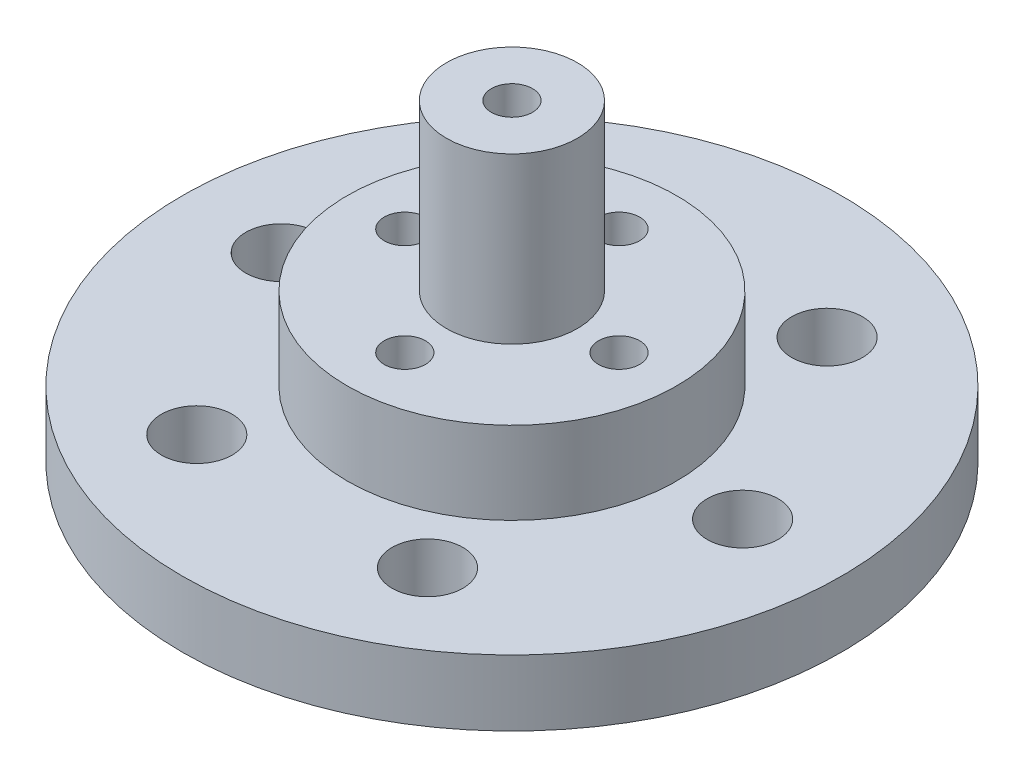
ISO-10303-21;
HEADER;
FILE_DESCRIPTION(('STEP AP214'),'2;1');
FILE_NAME('part.step','',(''),(''),'','','');
FILE_SCHEMA(('AUTOMOTIVE_DESIGN { 1 0 10303 214 1 1 1 1 }'));
ENDSEC;
DATA;
#1=APPLICATION_CONTEXT('core data for automotive mechanical design processes');
#2=APPLICATION_PROTOCOL_DEFINITION('international standard','automotive_design',2000,#1);
#3=PRODUCT_CONTEXT('',#1,'mechanical');
#4=PRODUCT('Part','Part','',(#3));
#5=PRODUCT_RELATED_PRODUCT_CATEGORY('part','',(#4));
#6=PRODUCT_DEFINITION_FORMATION('','',#4);
#7=PRODUCT_DEFINITION_CONTEXT('part definition',#1,'design');
#8=PRODUCT_DEFINITION('design','',#6,#7);
#9=PRODUCT_DEFINITION_SHAPE('','',#8);
#10=(LENGTH_UNIT() NAMED_UNIT(*) SI_UNIT(.MILLI.,.METRE.));
#11=(NAMED_UNIT(*) PLANE_ANGLE_UNIT() SI_UNIT($,.RADIAN.));
#12=(NAMED_UNIT(*) SI_UNIT($,.STERADIAN.) SOLID_ANGLE_UNIT());
#13=UNCERTAINTY_MEASURE_WITH_UNIT(LENGTH_MEASURE(1.E-05),#10,'distance_accuracy_value','');
#14=(GEOMETRIC_REPRESENTATION_CONTEXT(3) GLOBAL_UNCERTAINTY_ASSIGNED_CONTEXT((#13)) GLOBAL_UNIT_ASSIGNED_CONTEXT((#10,
#11,#12)) REPRESENTATION_CONTEXT('',''));
#15=CARTESIAN_POINT('',(0.,0.,0.));
#16=DIRECTION('',(0.,0.,1.));
#17=DIRECTION('',(1.,0.,0.));
#18=AXIS2_PLACEMENT_3D('',#15,#16,#17);
#19=CARTESIAN_POINT('',(0.,4.,0.));
#20=DIRECTION('',(0.,-1.,0.));
#21=DIRECTION('',(0.,0.,-1.));
#22=AXIS2_PLACEMENT_3D('',#19,#20,#21);
#23=CYLINDRICAL_SURFACE('',#22,20.);
#24=CARTESIAN_POINT('',(0.,4.,0.));
#25=DIRECTION('',(0.,1.,0.));
#26=DIRECTION('',(0.,0.,1.));
#27=AXIS2_PLACEMENT_3D('',#24,#25,#26);
#28=CIRCLE('',#27,20.);
#29=CARTESIAN_POINT('',(0.,4.,20.));
#30=VERTEX_POINT('',#29);
#31=EDGE_CURVE('E148',#30,#30,#28,.T.);
#32=ORIENTED_EDGE('',*,*,#31,.F.);
#33=EDGE_LOOP('',(#32));
#34=FACE_BOUND('',#33,.T.);
#35=CARTESIAN_POINT('',(0.,0.,0.));
#36=DIRECTION('',(0.,1.,0.));
#37=DIRECTION('',(0.,0.,1.));
#38=AXIS2_PLACEMENT_3D('',#35,#36,#37);
#39=CIRCLE('',#38,20.);
#40=CARTESIAN_POINT('',(0.,0.,20.));
#41=VERTEX_POINT('',#40);
#42=EDGE_CURVE('E44',#41,#41,#39,.T.);
#43=ORIENTED_EDGE('',*,*,#42,.T.);
#44=EDGE_LOOP('',(#43));
#45=FACE_BOUND('',#44,.T.);
#46=ADVANCED_FACE('F41',(#34,#45),#23,.T.);
#47=CARTESIAN_POINT('',(0.,4.,0.));
#48=DIRECTION('',(0.,1.,0.));
#49=DIRECTION('',(0.,0.,1.));
#50=AXIS2_PLACEMENT_3D('',#47,#48,#49);
#51=PLANE('',#50);
#52=CARTESIAN_POINT('',(-14.,4.,0.));
#53=DIRECTION('',(0.,1.,0.));
#54=DIRECTION('',(0.,0.,1.));
#55=AXIS2_PLACEMENT_3D('',#52,#53,#54);
#56=CIRCLE('',#55,2.15);
#57=CARTESIAN_POINT('',(-14.,4.,2.15));
#58=VERTEX_POINT('',#57);
#59=EDGE_CURVE('E105',#58,#58,#56,.T.);
#60=ORIENTED_EDGE('',*,*,#59,.F.);
#61=EDGE_LOOP('',(#60));
#62=FACE_BOUND('',#61,.T.);
#63=CARTESIAN_POINT('',(-6.99999999999997,4.,-12.1243556529822));
#64=DIRECTION('',(0.,1.,0.));
#65=DIRECTION('',(0.,0.,1.));
#66=AXIS2_PLACEMENT_3D('',#63,#64,#65);
#67=CIRCLE('',#66,2.15);
#68=CARTESIAN_POINT('',(-6.99999999999997,4.,-9.97435565298216));
#69=VERTEX_POINT('',#68);
#70=EDGE_CURVE('E111',#69,#69,#67,.T.);
#71=ORIENTED_EDGE('',*,*,#70,.F.);
#72=EDGE_LOOP('',(#71));
#73=FACE_BOUND('',#72,.T.);
#74=CARTESIAN_POINT('',(7.00000000000006,4.,-12.1243556529821));
#75=DIRECTION('',(0.,1.,0.));
#76=DIRECTION('',(0.,0.,1.));
#77=AXIS2_PLACEMENT_3D('',#74,#75,#76);
#78=CIRCLE('',#77,2.15);
#79=CARTESIAN_POINT('',(7.00000000000006,4.,-9.97435565298211));
#80=VERTEX_POINT('',#79);
#81=EDGE_CURVE('E117',#80,#80,#78,.T.);
#82=ORIENTED_EDGE('',*,*,#81,.F.);
#83=EDGE_LOOP('',(#82));
#84=FACE_BOUND('',#83,.T.);
#85=CARTESIAN_POINT('',(14.,4.,0.));
#86=DIRECTION('',(0.,1.,0.));
#87=DIRECTION('',(0.,0.,1.));
#88=AXIS2_PLACEMENT_3D('',#85,#86,#87);
#89=CIRCLE('',#88,2.15);
#90=CARTESIAN_POINT('',(14.,4.,2.1500000000001));
#91=VERTEX_POINT('',#90);
#92=EDGE_CURVE('E123',#91,#91,#89,.T.);
#93=ORIENTED_EDGE('',*,*,#92,.F.);
#94=EDGE_LOOP('',(#93));
#95=FACE_BOUND('',#94,.T.);
#96=CARTESIAN_POINT('',(6.99999999999989,4.,12.1243556529822));
#97=DIRECTION('',(0.,1.,0.));
#98=DIRECTION('',(0.,0.,1.));
#99=AXIS2_PLACEMENT_3D('',#96,#97,#98);
#100=CIRCLE('',#99,2.15);
#101=CARTESIAN_POINT('',(6.99999999999989,4.,14.2743556529822));
#102=VERTEX_POINT('',#101);
#103=EDGE_CURVE('E129',#102,#102,#100,.T.);
#104=ORIENTED_EDGE('',*,*,#103,.F.);
#105=EDGE_LOOP('',(#104));
#106=FACE_BOUND('',#105,.T.);
#107=CARTESIAN_POINT('',(-7.00000000000014,4.,12.1243556529821));
#108=DIRECTION('',(0.,1.,0.));
#109=DIRECTION('',(0.,0.,1.));
#110=AXIS2_PLACEMENT_3D('',#107,#108,#109);
#111=CIRCLE('',#110,2.15);
#112=CARTESIAN_POINT('',(-7.00000000000014,4.,14.2743556529821));
#113=VERTEX_POINT('',#112);
#114=EDGE_CURVE('E135',#113,#113,#111,.T.);
#115=ORIENTED_EDGE('',*,*,#114,.F.);
#116=EDGE_LOOP('',(#115));
#117=FACE_BOUND('',#116,.T.);
#118=CARTESIAN_POINT('',(0.,4.,0.));
#119=DIRECTION('',(0.,1.,0.));
#120=DIRECTION('',(0.,0.,1.));
#121=AXIS2_PLACEMENT_3D('',#118,#119,#120);
#122=CIRCLE('',#121,10.);
#123=CARTESIAN_POINT('',(0.,4.,10.));
#124=VERTEX_POINT('',#123);
#125=EDGE_CURVE('E49',#124,#124,#122,.T.);
#126=ORIENTED_EDGE('',*,*,#125,.F.);
#127=EDGE_LOOP('',(#126));
#128=FACE_BOUND('',#127,.T.);
#129=ORIENTED_EDGE('',*,*,#31,.T.);
#130=EDGE_LOOP('',(#129));
#131=FACE_BOUND('',#130,.T.);
#132=ADVANCED_FACE('F159',(#62,#73,#84,#95,#106,#117,#128,#131),#51,.T.);
#133=CARTESIAN_POINT('',(0.,0.,0.));
#134=DIRECTION('',(0.,1.,0.));
#135=DIRECTION('',(0.,0.,1.));
#136=AXIS2_PLACEMENT_3D('',#133,#134,#135);
#137=PLANE('',#136);
#138=CARTESIAN_POINT('',(-14.,0.,0.));
#139=DIRECTION('',(0.,1.,0.));
#140=DIRECTION('',(0.,0.,1.));
#141=AXIS2_PLACEMENT_3D('',#138,#139,#140);
#142=CIRCLE('',#141,2.15);
#143=CARTESIAN_POINT('',(-14.,0.,2.15));
#144=VERTEX_POINT('',#143);
#145=EDGE_CURVE('E108',#144,#144,#142,.T.);
#146=ORIENTED_EDGE('',*,*,#145,.T.);
#147=EDGE_LOOP('',(#146));
#148=FACE_BOUND('',#147,.T.);
#149=CARTESIAN_POINT('',(-6.99999999999997,0.,-12.1243556529822));
#150=DIRECTION('',(0.,1.,0.));
#151=DIRECTION('',(0.,0.,1.));
#152=AXIS2_PLACEMENT_3D('',#149,#150,#151);
#153=CIRCLE('',#152,2.15);
#154=CARTESIAN_POINT('',(-6.99999999999997,0.,-9.97435565298216));
#155=VERTEX_POINT('',#154);
#156=EDGE_CURVE('E114',#155,#155,#153,.T.);
#157=ORIENTED_EDGE('',*,*,#156,.T.);
#158=EDGE_LOOP('',(#157));
#159=FACE_BOUND('',#158,.T.);
#160=CARTESIAN_POINT('',(7.00000000000006,0.,-12.1243556529821));
#161=DIRECTION('',(0.,1.,0.));
#162=DIRECTION('',(0.,0.,1.));
#163=AXIS2_PLACEMENT_3D('',#160,#161,#162);
#164=CIRCLE('',#163,2.15);
#165=CARTESIAN_POINT('',(7.00000000000006,0.,-9.97435565298211));
#166=VERTEX_POINT('',#165);
#167=EDGE_CURVE('E120',#166,#166,#164,.T.);
#168=ORIENTED_EDGE('',*,*,#167,.T.);
#169=EDGE_LOOP('',(#168));
#170=FACE_BOUND('',#169,.T.);
#171=CARTESIAN_POINT('',(14.,0.,0.));
#172=DIRECTION('',(0.,1.,0.));
#173=DIRECTION('',(0.,0.,1.));
#174=AXIS2_PLACEMENT_3D('',#171,#172,#173);
#175=CIRCLE('',#174,2.15);
#176=CARTESIAN_POINT('',(14.,0.,2.15000000000009));
#177=VERTEX_POINT('',#176);
#178=EDGE_CURVE('E126',#177,#177,#175,.T.);
#179=ORIENTED_EDGE('',*,*,#178,.T.);
#180=EDGE_LOOP('',(#179));
#181=FACE_BOUND('',#180,.T.);
#182=CARTESIAN_POINT('',(6.99999999999989,0.,12.1243556529822));
#183=DIRECTION('',(0.,1.,0.));
#184=DIRECTION('',(0.,0.,1.));
#185=AXIS2_PLACEMENT_3D('',#182,#183,#184);
#186=CIRCLE('',#185,2.15);
#187=CARTESIAN_POINT('',(6.99999999999989,0.,14.2743556529822));
#188=VERTEX_POINT('',#187);
#189=EDGE_CURVE('E132',#188,#188,#186,.T.);
#190=ORIENTED_EDGE('',*,*,#189,.T.);
#191=EDGE_LOOP('',(#190));
#192=FACE_BOUND('',#191,.T.);
#193=CARTESIAN_POINT('',(-7.00000000000014,0.,12.1243556529821));
#194=DIRECTION('',(0.,1.,0.));
#195=DIRECTION('',(0.,0.,1.));
#196=AXIS2_PLACEMENT_3D('',#193,#194,#195);
#197=CIRCLE('',#196,2.15);
#198=CARTESIAN_POINT('',(-7.00000000000014,0.,14.2743556529821));
#199=VERTEX_POINT('',#198);
#200=EDGE_CURVE('E138',#199,#199,#197,.T.);
#201=ORIENTED_EDGE('',*,*,#200,.T.);
#202=EDGE_LOOP('',(#201));
#203=FACE_BOUND('',#202,.T.);
#204=ORIENTED_EDGE('',*,*,#42,.F.);
#205=EDGE_LOOP('',(#204));
#206=FACE_BOUND('',#205,.T.);
#207=ADVANCED_FACE('F156',(#148,#159,#170,#181,#192,#203,#206),#137,.F.);
#208=CARTESIAN_POINT('',(0.,9.,0.));
#209=DIRECTION('',(0.,-1.,0.));
#210=DIRECTION('',(0.,0.,-1.));
#211=AXIS2_PLACEMENT_3D('',#208,#209,#210);
#212=CYLINDRICAL_SURFACE('',#211,10.);
#213=CARTESIAN_POINT('',(0.,9.,0.));
#214=DIRECTION('',(0.,1.,0.));
#215=DIRECTION('',(0.,0.,1.));
#216=AXIS2_PLACEMENT_3D('',#213,#214,#215);
#217=CIRCLE('',#216,10.);
#218=CARTESIAN_POINT('',(0.,9.,10.));
#219=VERTEX_POINT('',#218);
#220=EDGE_CURVE('E143',#219,#219,#217,.T.);
#221=ORIENTED_EDGE('',*,*,#220,.F.);
#222=EDGE_LOOP('',(#221));
#223=FACE_BOUND('',#222,.T.);
#224=ORIENTED_EDGE('',*,*,#125,.T.);
#225=EDGE_LOOP('',(#224));
#226=FACE_BOUND('',#225,.T.);
#227=ADVANCED_FACE('F158',(#223,#226),#212,.T.);
#228=CARTESIAN_POINT('',(0.,9.,0.));
#229=DIRECTION('',(0.,1.,0.));
#230=DIRECTION('',(0.,0.,1.));
#231=AXIS2_PLACEMENT_3D('',#228,#229,#230);
#232=PLANE('',#231);
#233=CARTESIAN_POINT('',(-6.5,9.,0.));
#234=DIRECTION('',(0.,1.,0.));
#235=DIRECTION('',(0.,0.,1.));
#236=AXIS2_PLACEMENT_3D('',#233,#234,#235);
#237=CIRCLE('',#236,1.24999999999999);
#238=CARTESIAN_POINT('',(-6.5,9.,1.24999999999999));
#239=VERTEX_POINT('',#238);
#240=EDGE_CURVE('E76',#239,#239,#237,.T.);
#241=ORIENTED_EDGE('',*,*,#240,.F.);
#242=EDGE_LOOP('',(#241));
#243=FACE_BOUND('',#242,.T.);
#244=CARTESIAN_POINT('',(0.,9.,-6.5));
#245=DIRECTION('',(0.,1.,0.));
#246=DIRECTION('',(0.,0.,1.));
#247=AXIS2_PLACEMENT_3D('',#244,#245,#246);
#248=CIRCLE('',#247,1.24999999999999);
#249=CARTESIAN_POINT('',(0.,9.,-5.25000000000001));
#250=VERTEX_POINT('',#249);
#251=EDGE_CURVE('E87',#250,#250,#248,.T.);
#252=ORIENTED_EDGE('',*,*,#251,.F.);
#253=EDGE_LOOP('',(#252));
#254=FACE_BOUND('',#253,.T.);
#255=CARTESIAN_POINT('',(6.50000000000002,9.,0.));
#256=DIRECTION('',(0.,1.,0.));
#257=DIRECTION('',(0.,0.,1.));
#258=AXIS2_PLACEMENT_3D('',#255,#256,#257);
#259=CIRCLE('',#258,1.24999999999999);
#260=CARTESIAN_POINT('',(6.50000000000002,9.,1.25000000000001));
#261=VERTEX_POINT('',#260);
#262=EDGE_CURVE('E93',#261,#261,#259,.T.);
#263=ORIENTED_EDGE('',*,*,#262,.F.);
#264=EDGE_LOOP('',(#263));
#265=FACE_BOUND('',#264,.T.);
#266=CARTESIAN_POINT('',(0.,9.,6.50000000000002));
#267=DIRECTION('',(0.,1.,0.));
#268=DIRECTION('',(0.,0.,1.));
#269=AXIS2_PLACEMENT_3D('',#266,#267,#268);
#270=CIRCLE('',#269,1.24999999999999);
#271=CARTESIAN_POINT('',(0.,9.,7.75000000000001));
#272=VERTEX_POINT('',#271);
#273=EDGE_CURVE('E99',#272,#272,#270,.T.);
#274=ORIENTED_EDGE('',*,*,#273,.F.);
#275=EDGE_LOOP('',(#274));
#276=FACE_BOUND('',#275,.T.);
#277=CARTESIAN_POINT('',(0.,9.,0.));
#278=DIRECTION('',(0.,1.,0.));
#279=DIRECTION('',(0.,0.,1.));
#280=AXIS2_PLACEMENT_3D('',#277,#278,#279);
#281=CIRCLE('',#280,3.975);
#282=CARTESIAN_POINT('',(0.,9.,3.975));
#283=VERTEX_POINT('',#282);
#284=EDGE_CURVE('E11',#283,#283,#281,.T.);
#285=ORIENTED_EDGE('',*,*,#284,.F.);
#286=EDGE_LOOP('',(#285));
#287=FACE_BOUND('',#286,.T.);
#288=ORIENTED_EDGE('',*,*,#220,.T.);
#289=EDGE_LOOP('',(#288));
#290=FACE_BOUND('',#289,.T.);
#291=ADVANCED_FACE('F165',(#243,#254,#265,#276,#287,#290),#232,.T.);
#292=CARTESIAN_POINT('',(0.,19.,0.));
#293=DIRECTION('',(0.,-1.,0.));
#294=DIRECTION('',(0.,0.,-1.));
#295=AXIS2_PLACEMENT_3D('',#292,#293,#294);
#296=CYLINDRICAL_SURFACE('',#295,3.975);
#297=CARTESIAN_POINT('',(0.,19.,0.));
#298=DIRECTION('',(0.,1.,0.));
#299=DIRECTION('',(0.,0.,1.));
#300=AXIS2_PLACEMENT_3D('',#297,#298,#299);
#301=CIRCLE('',#300,3.975);
#302=CARTESIAN_POINT('',(0.,19.,3.975));
#303=VERTEX_POINT('',#302);
#304=EDGE_CURVE('E141',#303,#303,#301,.T.);
#305=ORIENTED_EDGE('',*,*,#304,.F.);
#306=EDGE_LOOP('',(#305));
#307=FACE_BOUND('',#306,.T.);
#308=ORIENTED_EDGE('',*,*,#284,.T.);
#309=EDGE_LOOP('',(#308));
#310=FACE_BOUND('',#309,.T.);
#311=ADVANCED_FACE('F186',(#307,#310),#296,.T.);
#312=CARTESIAN_POINT('',(0.,19.,0.));
#313=DIRECTION('',(0.,1.,0.));
#314=DIRECTION('',(0.,0.,1.));
#315=AXIS2_PLACEMENT_3D('',#312,#313,#314);
#316=PLANE('',#315);
#317=CARTESIAN_POINT('',(0.,19.,0.));
#318=DIRECTION('',(0.,1.,0.));
#319=DIRECTION('',(0.,0.,1.));
#320=AXIS2_PLACEMENT_3D('',#317,#318,#319);
#321=CIRCLE('',#320,1.24999999999999);
#322=CARTESIAN_POINT('',(0.,19.,1.24999999999999));
#323=VERTEX_POINT('',#322);
#324=EDGE_CURVE('E77',#323,#323,#321,.T.);
#325=ORIENTED_EDGE('',*,*,#324,.F.);
#326=EDGE_LOOP('',(#325));
#327=FACE_BOUND('',#326,.T.);
#328=ORIENTED_EDGE('',*,*,#304,.T.);
#329=EDGE_LOOP('',(#328));
#330=FACE_BOUND('',#329,.T.);
#331=ADVANCED_FACE('F201',(#327,#330),#316,.T.);
#332=CARTESIAN_POINT('',(-7.00000000000014,4.,12.1243556529821));
#333=DIRECTION('',(0.,1.,0.));
#334=DIRECTION('',(0.,0.,1.));
#335=AXIS2_PLACEMENT_3D('',#332,#333,#334);
#336=CYLINDRICAL_SURFACE('',#335,2.15);
#337=ORIENTED_EDGE('',*,*,#200,.F.);
#338=EDGE_LOOP('',(#337));
#339=FACE_BOUND('',#338,.T.);
#340=ORIENTED_EDGE('',*,*,#114,.T.);
#341=EDGE_LOOP('',(#340));
#342=FACE_BOUND('',#341,.T.);
#343=ADVANCED_FACE('F195',(#339,#342),#336,.F.);
#344=CARTESIAN_POINT('',(6.99999999999989,4.,12.1243556529822));
#345=DIRECTION('',(0.,1.,0.));
#346=DIRECTION('',(0.,0.,1.));
#347=AXIS2_PLACEMENT_3D('',#344,#345,#346);
#348=CYLINDRICAL_SURFACE('',#347,2.15);
#349=ORIENTED_EDGE('',*,*,#189,.F.);
#350=EDGE_LOOP('',(#349));
#351=FACE_BOUND('',#350,.T.);
#352=ORIENTED_EDGE('',*,*,#103,.T.);
#353=EDGE_LOOP('',(#352));
#354=FACE_BOUND('',#353,.T.);
#355=ADVANCED_FACE('F200',(#351,#354),#348,.F.);
#356=CARTESIAN_POINT('',(14.,4.,0.));
#357=DIRECTION('',(0.,1.,0.));
#358=DIRECTION('',(0.,0.,1.));
#359=AXIS2_PLACEMENT_3D('',#356,#357,#358);
#360=CYLINDRICAL_SURFACE('',#359,2.15);
#361=ORIENTED_EDGE('',*,*,#178,.F.);
#362=EDGE_LOOP('',(#361));
#363=FACE_BOUND('',#362,.T.);
#364=ORIENTED_EDGE('',*,*,#92,.T.);
#365=EDGE_LOOP('',(#364));
#366=FACE_BOUND('',#365,.T.);
#367=ADVANCED_FACE('F213',(#363,#366),#360,.F.);
#368=CARTESIAN_POINT('',(7.00000000000006,4.,-12.1243556529821));
#369=DIRECTION('',(0.,1.,0.));
#370=DIRECTION('',(0.,0.,1.));
#371=AXIS2_PLACEMENT_3D('',#368,#369,#370);
#372=CYLINDRICAL_SURFACE('',#371,2.15);
#373=ORIENTED_EDGE('',*,*,#167,.F.);
#374=EDGE_LOOP('',(#373));
#375=FACE_BOUND('',#374,.T.);
#376=ORIENTED_EDGE('',*,*,#81,.T.);
#377=EDGE_LOOP('',(#376));
#378=FACE_BOUND('',#377,.T.);
#379=ADVANCED_FACE('F223',(#375,#378),#372,.F.);
#380=CARTESIAN_POINT('',(-6.99999999999997,4.,-12.1243556529822));
#381=DIRECTION('',(0.,1.,0.));
#382=DIRECTION('',(0.,0.,1.));
#383=AXIS2_PLACEMENT_3D('',#380,#381,#382);
#384=CYLINDRICAL_SURFACE('',#383,2.15);
#385=ORIENTED_EDGE('',*,*,#156,.F.);
#386=EDGE_LOOP('',(#385));
#387=FACE_BOUND('',#386,.T.);
#388=ORIENTED_EDGE('',*,*,#70,.T.);
#389=EDGE_LOOP('',(#388));
#390=FACE_BOUND('',#389,.T.);
#391=ADVANCED_FACE('F233',(#387,#390),#384,.F.);
#392=CARTESIAN_POINT('',(-14.,4.,0.));
#393=DIRECTION('',(0.,1.,0.));
#394=DIRECTION('',(0.,0.,1.));
#395=AXIS2_PLACEMENT_3D('',#392,#393,#394);
#396=CYLINDRICAL_SURFACE('',#395,2.15);
#397=ORIENTED_EDGE('',*,*,#145,.F.);
#398=EDGE_LOOP('',(#397));
#399=FACE_BOUND('',#398,.T.);
#400=ORIENTED_EDGE('',*,*,#59,.T.);
#401=EDGE_LOOP('',(#400));
#402=FACE_BOUND('',#401,.T.);
#403=ADVANCED_FACE('F243',(#399,#402),#396,.F.);
#404=CARTESIAN_POINT('',(0.,4.,6.50000000000002));
#405=DIRECTION('',(0.,1.,0.));
#406=DIRECTION('',(0.,0.,1.));
#407=AXIS2_PLACEMENT_3D('',#404,#405,#406);
#408=CONICAL_SURFACE('',#407,1.25,1.02974425867665);
#409=CARTESIAN_POINT('',(0.,3.24892422621555,6.50000000000002));
#410=VERTEX_POINT('',#409);
#411=VERTEX_LOOP('',#410);
#412=FACE_BOUND('',#411,.T.);
#413=CARTESIAN_POINT('',(0.,4.,6.50000000000002));
#414=DIRECTION('',(0.,1.,0.));
#415=DIRECTION('',(0.,0.,1.));
#416=AXIS2_PLACEMENT_3D('',#413,#414,#415);
#417=CIRCLE('',#416,1.25);
#418=CARTESIAN_POINT('',(0.,4.,7.75000000000002));
#419=VERTEX_POINT('',#418);
#420=EDGE_CURVE('E102',#419,#419,#417,.T.);
#421=ORIENTED_EDGE('',*,*,#420,.T.);
#422=EDGE_LOOP('',(#421));
#423=FACE_BOUND('',#422,.T.);
#424=ADVANCED_FACE('F253',(#412,#423),#408,.F.);
#425=CARTESIAN_POINT('',(0.,9.,6.50000000000002));
#426=DIRECTION('',(0.,1.,0.));
#427=DIRECTION('',(0.,0.,1.));
#428=AXIS2_PLACEMENT_3D('',#425,#426,#427);
#429=CYLINDRICAL_SURFACE('',#428,1.24999999999999);
#430=ORIENTED_EDGE('',*,*,#420,.F.);
#431=EDGE_LOOP('',(#430));
#432=FACE_BOUND('',#431,.T.);
#433=ORIENTED_EDGE('',*,*,#273,.T.);
#434=EDGE_LOOP('',(#433));
#435=FACE_BOUND('',#434,.T.);
#436=ADVANCED_FACE('F277',(#432,#435),#429,.F.);
#437=CARTESIAN_POINT('',(6.50000000000002,4.,0.));
#438=DIRECTION('',(0.,1.,0.));
#439=DIRECTION('',(0.,0.,1.));
#440=AXIS2_PLACEMENT_3D('',#437,#438,#439);
#441=CONICAL_SURFACE('',#440,1.25,1.02974425867665);
#442=CARTESIAN_POINT('',(6.50000000000002,3.24892422621555,0.));
#443=VERTEX_POINT('',#442);
#444=VERTEX_LOOP('',#443);
#445=FACE_BOUND('',#444,.T.);
#446=CARTESIAN_POINT('',(6.50000000000002,4.,0.));
#447=DIRECTION('',(0.,1.,0.));
#448=DIRECTION('',(0.,0.,1.));
#449=AXIS2_PLACEMENT_3D('',#446,#447,#448);
#450=CIRCLE('',#449,1.25);
#451=CARTESIAN_POINT('',(6.50000000000002,4.,1.25000000000002));
#452=VERTEX_POINT('',#451);
#453=EDGE_CURVE('E96',#452,#452,#450,.T.);
#454=ORIENTED_EDGE('',*,*,#453,.T.);
#455=EDGE_LOOP('',(#454));
#456=FACE_BOUND('',#455,.T.);
#457=ADVANCED_FACE('F287',(#445,#456),#441,.F.);
#458=CARTESIAN_POINT('',(6.50000000000002,9.,0.));
#459=DIRECTION('',(0.,1.,0.));
#460=DIRECTION('',(0.,0.,1.));
#461=AXIS2_PLACEMENT_3D('',#458,#459,#460);
#462=CYLINDRICAL_SURFACE('',#461,1.24999999999999);
#463=ORIENTED_EDGE('',*,*,#453,.F.);
#464=EDGE_LOOP('',(#463));
#465=FACE_BOUND('',#464,.T.);
#466=ORIENTED_EDGE('',*,*,#262,.T.);
#467=EDGE_LOOP('',(#466));
#468=FACE_BOUND('',#467,.T.);
#469=ADVANCED_FACE('F298',(#465,#468),#462,.F.);
#470=CARTESIAN_POINT('',(0.,4.,-6.5));
#471=DIRECTION('',(0.,1.,0.));
#472=DIRECTION('',(0.,0.,1.));
#473=AXIS2_PLACEMENT_3D('',#470,#471,#472);
#474=CONICAL_SURFACE('',#473,1.25,1.02974425867665);
#475=CARTESIAN_POINT('',(0.,3.24892422621555,-6.5));
#476=VERTEX_POINT('',#475);
#477=VERTEX_LOOP('',#476);
#478=FACE_BOUND('',#477,.T.);
#479=CARTESIAN_POINT('',(0.,4.,-6.5));
#480=DIRECTION('',(0.,1.,0.));
#481=DIRECTION('',(0.,0.,1.));
#482=AXIS2_PLACEMENT_3D('',#479,#480,#481);
#483=CIRCLE('',#482,1.25);
#484=CARTESIAN_POINT('',(0.,4.,-5.25));
#485=VERTEX_POINT('',#484);
#486=EDGE_CURVE('E90',#485,#485,#483,.T.);
#487=ORIENTED_EDGE('',*,*,#486,.T.);
#488=EDGE_LOOP('',(#487));
#489=FACE_BOUND('',#488,.T.);
#490=ADVANCED_FACE('F307',(#478,#489),#474,.F.);
#491=CARTESIAN_POINT('',(0.,9.,-6.5));
#492=DIRECTION('',(0.,1.,0.));
#493=DIRECTION('',(0.,0.,1.));
#494=AXIS2_PLACEMENT_3D('',#491,#492,#493);
#495=CYLINDRICAL_SURFACE('',#494,1.24999999999999);
#496=ORIENTED_EDGE('',*,*,#486,.F.);
#497=EDGE_LOOP('',(#496));
#498=FACE_BOUND('',#497,.T.);
#499=ORIENTED_EDGE('',*,*,#251,.T.);
#500=EDGE_LOOP('',(#499));
#501=FACE_BOUND('',#500,.T.);
#502=ADVANCED_FACE('F318',(#498,#501),#495,.F.);
#503=CARTESIAN_POINT('',(-6.5,4.,0.));
#504=DIRECTION('',(0.,1.,0.));
#505=DIRECTION('',(0.,0.,1.));
#506=AXIS2_PLACEMENT_3D('',#503,#504,#505);
#507=CONICAL_SURFACE('',#506,1.25,1.02974425867665);
#508=CARTESIAN_POINT('',(-6.5,3.24892422621555,0.));
#509=VERTEX_POINT('',#508);
#510=VERTEX_LOOP('',#509);
#511=FACE_BOUND('',#510,.T.);
#512=CARTESIAN_POINT('',(-6.5,4.,0.));
#513=DIRECTION('',(0.,1.,0.));
#514=DIRECTION('',(0.,0.,1.));
#515=AXIS2_PLACEMENT_3D('',#512,#513,#514);
#516=CIRCLE('',#515,1.25);
#517=CARTESIAN_POINT('',(-6.5,4.,1.25));
#518=VERTEX_POINT('',#517);
#519=EDGE_CURVE('E80',#518,#518,#516,.T.);
#520=ORIENTED_EDGE('',*,*,#519,.T.);
#521=EDGE_LOOP('',(#520));
#522=FACE_BOUND('',#521,.T.);
#523=ADVANCED_FACE('F328',(#511,#522),#507,.F.);
#524=CARTESIAN_POINT('',(-6.5,9.,0.));
#525=DIRECTION('',(0.,1.,0.));
#526=DIRECTION('',(0.,0.,1.));
#527=AXIS2_PLACEMENT_3D('',#524,#525,#526);
#528=CYLINDRICAL_SURFACE('',#527,1.24999999999999);
#529=ORIENTED_EDGE('',*,*,#519,.F.);
#530=EDGE_LOOP('',(#529));
#531=FACE_BOUND('',#530,.T.);
#532=ORIENTED_EDGE('',*,*,#240,.T.);
#533=EDGE_LOOP('',(#532));
#534=FACE_BOUND('',#533,.T.);
#535=ADVANCED_FACE('F70',(#531,#534),#528,.F.);
#536=CARTESIAN_POINT('',(0.,14.,0.));
#537=DIRECTION('',(0.,1.,0.));
#538=DIRECTION('',(0.,0.,1.));
#539=AXIS2_PLACEMENT_3D('',#536,#537,#538);
#540=CONICAL_SURFACE('',#539,1.25,1.02974425867665);
#541=CARTESIAN_POINT('',(0.,13.2489242262156,0.));
#542=VERTEX_POINT('',#541);
#543=VERTEX_LOOP('',#542);
#544=FACE_BOUND('',#543,.T.);
#545=CARTESIAN_POINT('',(0.,14.,0.));
#546=DIRECTION('',(0.,1.,0.));
#547=DIRECTION('',(0.,0.,1.));
#548=AXIS2_PLACEMENT_3D('',#545,#546,#547);
#549=CIRCLE('',#548,1.25);
#550=CARTESIAN_POINT('',(0.,14.,1.25));
#551=VERTEX_POINT('',#550);
#552=EDGE_CURVE('E74',#551,#551,#549,.T.);
#553=ORIENTED_EDGE('',*,*,#552,.T.);
#554=EDGE_LOOP('',(#553));
#555=FACE_BOUND('',#554,.T.);
#556=ADVANCED_FACE('F66',(#544,#555),#540,.F.);
#557=CARTESIAN_POINT('',(0.,19.,0.));
#558=DIRECTION('',(0.,1.,0.));
#559=DIRECTION('',(0.,0.,1.));
#560=AXIS2_PLACEMENT_3D('',#557,#558,#559);
#561=CYLINDRICAL_SURFACE('',#560,1.24999999999999);
#562=ORIENTED_EDGE('',*,*,#552,.F.);
#563=EDGE_LOOP('',(#562));
#564=FACE_BOUND('',#563,.T.);
#565=ORIENTED_EDGE('',*,*,#324,.T.);
#566=EDGE_LOOP('',(#565));
#567=FACE_BOUND('',#566,.T.);
#568=ADVANCED_FACE('F69',(#564,#567),#561,.F.);
#569=CLOSED_SHELL('',(#46,#132,#207,#227,#291,#311,#331,#343,#355,#367,#379,#391,#403,#424,#436,
#457,#469,#490,#502,#523,#535,#556,#568));
#570=MANIFOLD_SOLID_BREP('B2',#569);
#571=ADVANCED_BREP_SHAPE_REPRESENTATION('',(#18,#570),#14);
#572=SHAPE_DEFINITION_REPRESENTATION(#9,#571);
ENDSEC;
END-ISO-10303-21;
